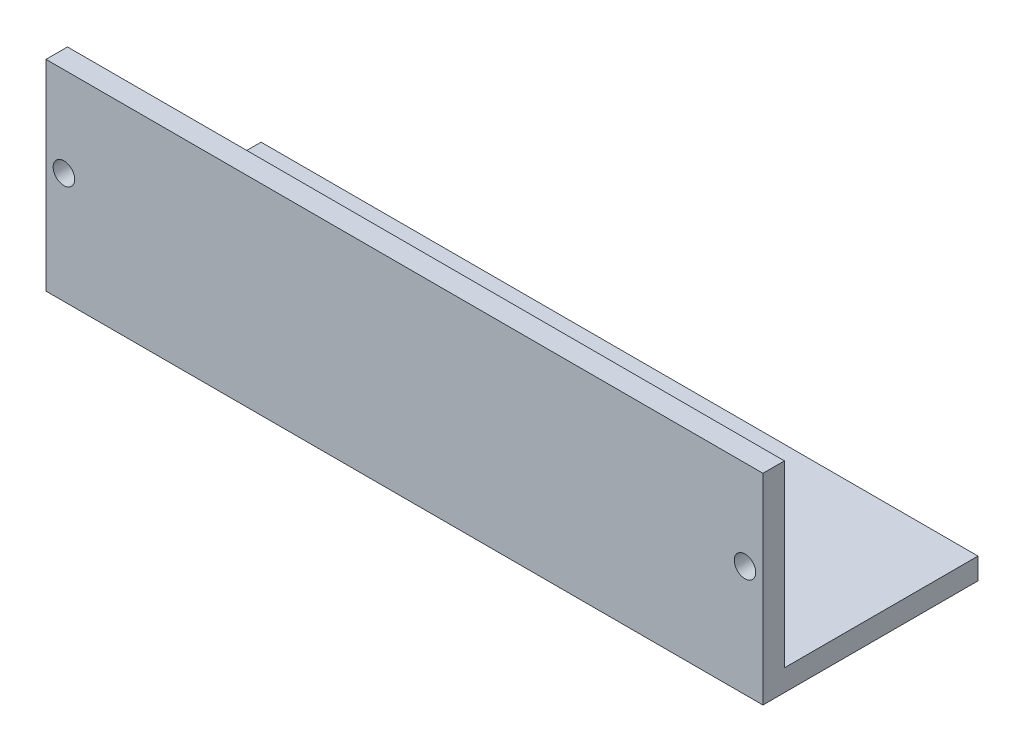
ISO-10303-21;
HEADER;
FILE_DESCRIPTION(('STEP AP214'),'2;1');
FILE_NAME('part.step','',(''),(''),'','','');
FILE_SCHEMA(('AUTOMOTIVE_DESIGN { 1 0 10303 214 1 1 1 1 }'));
ENDSEC;
DATA;
#1=APPLICATION_CONTEXT('core data for automotive mechanical design processes');
#2=APPLICATION_PROTOCOL_DEFINITION('international standard','automotive_design',2000,#1);
#3=PRODUCT_CONTEXT('',#1,'mechanical');
#4=PRODUCT('Part','Part','',(#3));
#5=PRODUCT_RELATED_PRODUCT_CATEGORY('part','',(#4));
#6=PRODUCT_DEFINITION_FORMATION('','',#4);
#7=PRODUCT_DEFINITION_CONTEXT('part definition',#1,'design');
#8=PRODUCT_DEFINITION('design','',#6,#7);
#9=PRODUCT_DEFINITION_SHAPE('','',#8);
#10=(LENGTH_UNIT() NAMED_UNIT(*) SI_UNIT(.MILLI.,.METRE.));
#11=(NAMED_UNIT(*) PLANE_ANGLE_UNIT() SI_UNIT($,.RADIAN.));
#12=(NAMED_UNIT(*) SI_UNIT($,.STERADIAN.) SOLID_ANGLE_UNIT());
#13=UNCERTAINTY_MEASURE_WITH_UNIT(LENGTH_MEASURE(1.E-05),#10,'distance_accuracy_value','');
#14=(GEOMETRIC_REPRESENTATION_CONTEXT(3) GLOBAL_UNCERTAINTY_ASSIGNED_CONTEXT((#13)) GLOBAL_UNIT_ASSIGNED_CONTEXT((#10,
#11,#12)) REPRESENTATION_CONTEXT('',''));
#15=CARTESIAN_POINT('',(0.,0.,0.));
#16=DIRECTION('',(0.,0.,1.));
#17=DIRECTION('',(1.,0.,0.));
#18=AXIS2_PLACEMENT_3D('',#15,#16,#17);
#19=CARTESIAN_POINT('',(0.,0.,0.));
#20=DIRECTION('',(0.,0.,1.));
#21=DIRECTION('',(1.,0.,0.));
#22=AXIS2_PLACEMENT_3D('',#19,#20,#21);
#23=PLANE('',#22);
#24=CARTESIAN_POINT('',(-47.5,0.,0.));
#25=DIRECTION('',(0.,0.,1.));
#26=DIRECTION('',(1.,0.,0.));
#27=AXIS2_PLACEMENT_3D('',#24,#25,#26);
#28=CIRCLE('',#27,1.5);
#29=CARTESIAN_POINT('',(-46.,0.,0.));
#30=VERTEX_POINT('',#29);
#31=EDGE_CURVE('E162',#30,#30,#28,.T.);
#32=ORIENTED_EDGE('',*,*,#31,.T.);
#33=EDGE_LOOP('',(#32));
#34=FACE_BOUND('',#33,.T.);
#35=DIRECTION('',(0.,1.,0.));
#36=VECTOR('',#35,1.);
#37=CARTESIAN_POINT('',(-20.,0.,0.));
#38=LINE('',#37,#36);
#39=CARTESIAN_POINT('',(-20.,-12.5,0.));
#40=VERTEX_POINT('',#39);
#41=CARTESIAN_POINT('',(-20.,12.5,0.));
#42=VERTEX_POINT('',#41);
#43=EDGE_CURVE('E117',#40,#42,#38,.T.);
#44=ORIENTED_EDGE('',*,*,#43,.F.);
#45=DIRECTION('',(1.,0.,0.));
#46=VECTOR('',#45,1.);
#47=CARTESIAN_POINT('',(-50.,-12.5,0.));
#48=LINE('',#47,#46);
#49=CARTESIAN_POINT('',(-50.,-12.5,0.));
#50=VERTEX_POINT('',#49);
#51=EDGE_CURVE('E106',#50,#40,#48,.T.);
#52=ORIENTED_EDGE('',*,*,#51,.F.);
#53=DIRECTION('',(0.,-1.,0.));
#54=VECTOR('',#53,1.);
#55=CARTESIAN_POINT('',(-50.,12.5,0.));
#56=LINE('',#55,#54);
#57=CARTESIAN_POINT('',(-50.,12.5,0.));
#58=VERTEX_POINT('',#57);
#59=EDGE_CURVE('E182',#58,#50,#56,.T.);
#60=ORIENTED_EDGE('',*,*,#59,.F.);
#61=DIRECTION('',(-1.,0.,0.));
#62=VECTOR('',#61,1.);
#63=CARTESIAN_POINT('',(-50.,12.5,0.));
#64=LINE('',#63,#62);
#65=EDGE_CURVE('E48',#42,#58,#64,.T.);
#66=ORIENTED_EDGE('',*,*,#65,.F.);
#67=EDGE_LOOP('',(#44,#52,#60,#66));
#68=FACE_BOUND('',#67,.T.);
#69=ADVANCED_FACE('F33',(#34,#68),#23,.F.);
#70=CARTESIAN_POINT('',(0.,0.,3.));
#71=DIRECTION('',(0.,0.,1.));
#72=DIRECTION('',(1.,0.,0.));
#73=AXIS2_PLACEMENT_3D('',#70,#71,#72);
#74=PLANE('',#73);
#75=DIRECTION('',(-1.,0.,0.));
#76=VECTOR('',#75,1.);
#77=CARTESIAN_POINT('',(-50.,12.5,3.));
#78=LINE('',#77,#76);
#79=CARTESIAN_POINT('',(50.,12.5,3.));
#80=VERTEX_POINT('',#79);
#81=CARTESIAN_POINT('',(-50.,12.5,3.));
#82=VERTEX_POINT('',#81);
#83=EDGE_CURVE('E173',#80,#82,#78,.T.);
#84=ORIENTED_EDGE('',*,*,#83,.T.);
#85=DIRECTION('',(0.,-1.,0.));
#86=VECTOR('',#85,1.);
#87=CARTESIAN_POINT('',(-50.,12.5,3.));
#88=LINE('',#87,#86);
#89=CARTESIAN_POINT('',(-50.,-15.5,3.));
#90=VERTEX_POINT('',#89);
#91=EDGE_CURVE('E175',#82,#90,#88,.T.);
#92=ORIENTED_EDGE('',*,*,#91,.T.);
#93=DIRECTION('',(-1.,0.,0.));
#94=VECTOR('',#93,1.);
#95=CARTESIAN_POINT('',(-50.,-15.5,3.));
#96=LINE('',#95,#94);
#97=CARTESIAN_POINT('',(50.,-15.5,3.));
#98=VERTEX_POINT('',#97);
#99=EDGE_CURVE('E145',#98,#90,#96,.T.);
#100=ORIENTED_EDGE('',*,*,#99,.F.);
#101=DIRECTION('',(0.,1.,0.));
#102=VECTOR('',#101,1.);
#103=CARTESIAN_POINT('',(50.,12.5,3.));
#104=LINE('',#103,#102);
#105=EDGE_CURVE('E113',#98,#80,#104,.T.);
#106=ORIENTED_EDGE('',*,*,#105,.T.);
#107=EDGE_LOOP('',(#84,#92,#100,#106));
#108=FACE_BOUND('',#107,.T.);
#109=CARTESIAN_POINT('',(47.5,0.,3.));
#110=DIRECTION('',(0.,0.,1.));
#111=DIRECTION('',(1.,0.,0.));
#112=AXIS2_PLACEMENT_3D('',#109,#110,#111);
#113=CIRCLE('',#112,1.5);
#114=CARTESIAN_POINT('',(49.,0.,3.));
#115=VERTEX_POINT('',#114);
#116=EDGE_CURVE('E159',#115,#115,#113,.T.);
#117=ORIENTED_EDGE('',*,*,#116,.F.);
#118=EDGE_LOOP('',(#117));
#119=FACE_BOUND('',#118,.T.);
#120=CARTESIAN_POINT('',(-47.5,0.,3.));
#121=DIRECTION('',(0.,0.,1.));
#122=DIRECTION('',(1.,0.,0.));
#123=AXIS2_PLACEMENT_3D('',#120,#121,#122);
#124=CIRCLE('',#123,1.5);
#125=CARTESIAN_POINT('',(-46.,0.,3.));
#126=VERTEX_POINT('',#125);
#127=EDGE_CURVE('E165',#126,#126,#124,.T.);
#128=ORIENTED_EDGE('',*,*,#127,.F.);
#129=EDGE_LOOP('',(#128));
#130=FACE_BOUND('',#129,.T.);
#131=ADVANCED_FACE('F214',(#108,#119,#130),#74,.T.);
#132=CARTESIAN_POINT('',(20.,-12.5,0.));
#133=VERTEX_POINT('',#132);
#134=CARTESIAN_POINT('',(50.,-12.5,0.));
#135=VERTEX_POINT('',#134);
#136=EDGE_CURVE('E114',#133,#135,#48,.T.);
#137=ORIENTED_EDGE('',*,*,#136,.F.);
#138=DIRECTION('',(0.,1.,0.));
#139=VECTOR('',#138,1.);
#140=CARTESIAN_POINT('',(20.,0.,0.));
#141=LINE('',#140,#139);
#142=CARTESIAN_POINT('',(20.,12.5,0.));
#143=VERTEX_POINT('',#142);
#144=EDGE_CURVE('E56',#133,#143,#141,.T.);
#145=ORIENTED_EDGE('',*,*,#144,.T.);
#146=CARTESIAN_POINT('',(50.,12.5,0.));
#147=VERTEX_POINT('',#146);
#148=EDGE_CURVE('E180',#147,#143,#64,.T.);
#149=ORIENTED_EDGE('',*,*,#148,.F.);
#150=DIRECTION('',(0.,1.,0.));
#151=VECTOR('',#150,1.);
#152=CARTESIAN_POINT('',(50.,12.5,0.));
#153=LINE('',#152,#151);
#154=EDGE_CURVE('E168',#135,#147,#153,.T.);
#155=ORIENTED_EDGE('',*,*,#154,.F.);
#156=EDGE_LOOP('',(#137,#145,#149,#155));
#157=FACE_BOUND('',#156,.T.);
#158=CARTESIAN_POINT('',(47.5,0.,0.));
#159=DIRECTION('',(0.,0.,1.));
#160=DIRECTION('',(1.,0.,0.));
#161=AXIS2_PLACEMENT_3D('',#158,#159,#160);
#162=CIRCLE('',#161,1.5);
#163=CARTESIAN_POINT('',(49.,0.,0.));
#164=VERTEX_POINT('',#163);
#165=EDGE_CURVE('E158',#164,#164,#162,.T.);
#166=ORIENTED_EDGE('',*,*,#165,.T.);
#167=EDGE_LOOP('',(#166));
#168=FACE_BOUND('',#167,.T.);
#169=ADVANCED_FACE('F201',(#157,#168),#23,.F.);
#170=CARTESIAN_POINT('',(50.,12.5,3.));
#171=DIRECTION('',(-1.,0.,0.));
#172=DIRECTION('',(0.,-1.,0.));
#173=AXIS2_PLACEMENT_3D('',#170,#171,#172);
#174=PLANE('',#173);
#175=ORIENTED_EDGE('',*,*,#154,.T.);
#176=DIRECTION('',(0.,0.,-1.));
#177=VECTOR('',#176,1.);
#178=CARTESIAN_POINT('',(50.,12.5,3.));
#179=LINE('',#178,#177);
#180=EDGE_CURVE('E11',#80,#147,#179,.T.);
#181=ORIENTED_EDGE('',*,*,#180,.F.);
#182=ORIENTED_EDGE('',*,*,#105,.F.);
#183=DIRECTION('',(0.,0.,1.));
#184=VECTOR('',#183,1.);
#185=CARTESIAN_POINT('',(50.,-15.5,3.));
#186=LINE('',#185,#184);
#187=CARTESIAN_POINT('',(50.,-15.5,-27.));
#188=VERTEX_POINT('',#187);
#189=EDGE_CURVE('E142',#188,#98,#186,.T.);
#190=ORIENTED_EDGE('',*,*,#189,.F.);
#191=DIRECTION('',(0.,1.,0.));
#192=VECTOR('',#191,1.);
#193=CARTESIAN_POINT('',(50.,-15.5,-27.));
#194=LINE('',#193,#192);
#195=CARTESIAN_POINT('',(50.,-12.5,-27.));
#196=VERTEX_POINT('',#195);
#197=EDGE_CURVE('E147',#188,#196,#194,.T.);
#198=ORIENTED_EDGE('',*,*,#197,.T.);
#199=DIRECTION('',(0.,0.,1.));
#200=VECTOR('',#199,1.);
#201=CARTESIAN_POINT('',(50.,-12.5,3.));
#202=LINE('',#201,#200);
#203=EDGE_CURVE('E140',#196,#135,#202,.T.);
#204=ORIENTED_EDGE('',*,*,#203,.T.);
#205=EDGE_LOOP('',(#175,#181,#182,#190,#198,#204));
#206=FACE_BOUND('',#205,.T.);
#207=ADVANCED_FACE('F35',(#206),#174,.F.);
#208=CARTESIAN_POINT('',(-50.,12.5,3.));
#209=DIRECTION('',(0.,-1.,0.));
#210=DIRECTION('',(0.,0.,-1.));
#211=AXIS2_PLACEMENT_3D('',#208,#209,#210);
#212=PLANE('',#211);
#213=ORIENTED_EDGE('',*,*,#148,.T.);
#214=DIRECTION('',(-1.,0.,0.));
#215=VECTOR('',#214,1.);
#216=CARTESIAN_POINT('',(-50.,12.5,0.));
#217=LINE('',#216,#215);
#218=EDGE_CURVE('E133',#42,#143,#217,.F.);
#219=ORIENTED_EDGE('',*,*,#218,.F.);
#220=ORIENTED_EDGE('',*,*,#65,.T.);
#221=DIRECTION('',(0.,0.,-1.));
#222=VECTOR('',#221,1.);
#223=CARTESIAN_POINT('',(-50.,12.5,3.));
#224=LINE('',#223,#222);
#225=EDGE_CURVE('E41',#82,#58,#224,.T.);
#226=ORIENTED_EDGE('',*,*,#225,.F.);
#227=ORIENTED_EDGE('',*,*,#83,.F.);
#228=ORIENTED_EDGE('',*,*,#180,.T.);
#229=EDGE_LOOP('',(#213,#219,#220,#226,#227,#228));
#230=FACE_BOUND('',#229,.T.);
#231=ADVANCED_FACE('F190',(#230),#212,.F.);
#232=CARTESIAN_POINT('',(-50.,12.5,3.));
#233=DIRECTION('',(1.,0.,0.));
#234=DIRECTION('',(0.,1.,0.));
#235=AXIS2_PLACEMENT_3D('',#232,#233,#234);
#236=PLANE('',#235);
#237=ORIENTED_EDGE('',*,*,#59,.T.);
#238=DIRECTION('',(0.,0.,-1.));
#239=VECTOR('',#238,1.);
#240=CARTESIAN_POINT('',(-50.,-12.5,3.));
#241=LINE('',#240,#239);
#242=CARTESIAN_POINT('',(-50.,-12.5,-27.));
#243=VERTEX_POINT('',#242);
#244=EDGE_CURVE('E112',#50,#243,#241,.T.);
#245=ORIENTED_EDGE('',*,*,#244,.T.);
#246=DIRECTION('',(0.,1.,0.));
#247=VECTOR('',#246,1.);
#248=CARTESIAN_POINT('',(-50.,-15.5,-27.));
#249=LINE('',#248,#247);
#250=CARTESIAN_POINT('',(-50.,-15.5,-27.));
#251=VERTEX_POINT('',#250);
#252=EDGE_CURVE('E155',#251,#243,#249,.T.);
#253=ORIENTED_EDGE('',*,*,#252,.F.);
#254=DIRECTION('',(0.,0.,-1.));
#255=VECTOR('',#254,1.);
#256=CARTESIAN_POINT('',(-50.,-15.5,3.));
#257=LINE('',#256,#255);
#258=EDGE_CURVE('E136',#90,#251,#257,.T.);
#259=ORIENTED_EDGE('',*,*,#258,.F.);
#260=ORIENTED_EDGE('',*,*,#91,.F.);
#261=ORIENTED_EDGE('',*,*,#225,.T.);
#262=EDGE_LOOP('',(#237,#245,#253,#259,#260,#261));
#263=FACE_BOUND('',#262,.T.);
#264=ADVANCED_FACE('F187',(#263),#236,.F.);
#265=CARTESIAN_POINT('',(-47.5,0.,3.));
#266=DIRECTION('',(0.,0.,-1.));
#267=DIRECTION('',(-1.,0.,0.));
#268=AXIS2_PLACEMENT_3D('',#265,#266,#267);
#269=CYLINDRICAL_SURFACE('',#268,1.5);
#270=ORIENTED_EDGE('',*,*,#127,.T.);
#271=EDGE_LOOP('',(#270));
#272=FACE_BOUND('',#271,.T.);
#273=ORIENTED_EDGE('',*,*,#31,.F.);
#274=EDGE_LOOP('',(#273));
#275=FACE_BOUND('',#274,.T.);
#276=ADVANCED_FACE('F222',(#272,#275),#269,.F.);
#277=CARTESIAN_POINT('',(47.5,0.,3.));
#278=DIRECTION('',(0.,0.,-1.));
#279=DIRECTION('',(-1.,0.,0.));
#280=AXIS2_PLACEMENT_3D('',#277,#278,#279);
#281=CYLINDRICAL_SURFACE('',#280,1.5);
#282=ORIENTED_EDGE('',*,*,#116,.T.);
#283=EDGE_LOOP('',(#282));
#284=FACE_BOUND('',#283,.T.);
#285=ORIENTED_EDGE('',*,*,#165,.F.);
#286=EDGE_LOOP('',(#285));
#287=FACE_BOUND('',#286,.T.);
#288=ADVANCED_FACE('F225',(#284,#287),#281,.F.);
#289=CARTESIAN_POINT('',(0.,-12.5,0.));
#290=DIRECTION('',(0.,-1.,0.));
#291=DIRECTION('',(0.,0.,-1.));
#292=AXIS2_PLACEMENT_3D('',#289,#290,#291);
#293=PLANE('',#292);
#294=DIRECTION('',(-1.,0.,0.));
#295=VECTOR('',#294,1.);
#296=CARTESIAN_POINT('',(0.,-12.5,-10.));
#297=LINE('',#296,#295);
#298=CARTESIAN_POINT('',(-20.,-12.5,-10.));
#299=VERTEX_POINT('',#298);
#300=CARTESIAN_POINT('',(20.,-12.5,-10.));
#301=VERTEX_POINT('',#300);
#302=EDGE_CURVE('E131',#299,#301,#297,.F.);
#303=ORIENTED_EDGE('',*,*,#302,.T.);
#304=DIRECTION('',(0.,0.,1.));
#305=VECTOR('',#304,1.);
#306=CARTESIAN_POINT('',(20.,-12.5,0.));
#307=LINE('',#306,#305);
#308=EDGE_CURVE('E126',#301,#133,#307,.T.);
#309=ORIENTED_EDGE('',*,*,#308,.T.);
#310=ORIENTED_EDGE('',*,*,#136,.T.);
#311=ORIENTED_EDGE('',*,*,#203,.F.);
#312=DIRECTION('',(1.,0.,0.));
#313=VECTOR('',#312,1.);
#314=CARTESIAN_POINT('',(-50.,-12.5,-27.));
#315=LINE('',#314,#313);
#316=EDGE_CURVE('E149',#243,#196,#315,.T.);
#317=ORIENTED_EDGE('',*,*,#316,.F.);
#318=ORIENTED_EDGE('',*,*,#244,.F.);
#319=ORIENTED_EDGE('',*,*,#51,.T.);
#320=DIRECTION('',(0.,0.,1.));
#321=VECTOR('',#320,1.);
#322=CARTESIAN_POINT('',(-20.,-12.5,0.));
#323=LINE('',#322,#321);
#324=EDGE_CURVE('E109',#299,#40,#323,.T.);
#325=ORIENTED_EDGE('',*,*,#324,.F.);
#326=EDGE_LOOP('',(#303,#309,#310,#311,#317,#318,#319,#325));
#327=FACE_BOUND('',#326,.T.);
#328=ADVANCED_FACE('F107',(#327),#293,.F.);
#329=CARTESIAN_POINT('',(-50.,-15.5,-27.));
#330=DIRECTION('',(0.,0.,1.));
#331=DIRECTION('',(1.,0.,0.));
#332=AXIS2_PLACEMENT_3D('',#329,#330,#331);
#333=PLANE('',#332);
#334=ORIENTED_EDGE('',*,*,#316,.T.);
#335=ORIENTED_EDGE('',*,*,#197,.F.);
#336=DIRECTION('',(1.,0.,0.));
#337=VECTOR('',#336,1.);
#338=CARTESIAN_POINT('',(-50.,-15.5,-27.));
#339=LINE('',#338,#337);
#340=EDGE_CURVE('E139',#251,#188,#339,.T.);
#341=ORIENTED_EDGE('',*,*,#340,.F.);
#342=ORIENTED_EDGE('',*,*,#252,.T.);
#343=EDGE_LOOP('',(#334,#335,#341,#342));
#344=FACE_BOUND('',#343,.T.);
#345=ADVANCED_FACE('F209',(#344),#333,.F.);
#346=CARTESIAN_POINT('',(0.,-15.5,0.));
#347=DIRECTION('',(0.,-1.,0.));
#348=DIRECTION('',(0.,0.,-1.));
#349=AXIS2_PLACEMENT_3D('',#346,#347,#348);
#350=PLANE('',#349);
#351=ORIENTED_EDGE('',*,*,#99,.T.);
#352=ORIENTED_EDGE('',*,*,#258,.T.);
#353=ORIENTED_EDGE('',*,*,#340,.T.);
#354=ORIENTED_EDGE('',*,*,#189,.T.);
#355=EDGE_LOOP('',(#351,#352,#353,#354));
#356=FACE_BOUND('',#355,.T.);
#357=ADVANCED_FACE('F211',(#356),#350,.T.);
#358=CARTESIAN_POINT('',(0.,12.5,0.));
#359=DIRECTION('',(0.,-0.371390676354104,0.928476690885259));
#360=DIRECTION('',(0.,-0.928476690885259,-0.371390676354104));
#361=AXIS2_PLACEMENT_3D('',#358,#359,#360);
#362=PLANE('',#361);
#363=DIRECTION('',(0.,-0.928476690885259,-0.371390676354104));
#364=VECTOR('',#363,1.);
#365=CARTESIAN_POINT('',(-20.,12.5,0.));
#366=LINE('',#365,#364);
#367=EDGE_CURVE('E124',#42,#299,#366,.T.);
#368=ORIENTED_EDGE('',*,*,#367,.F.);
#369=ORIENTED_EDGE('',*,*,#218,.T.);
#370=DIRECTION('',(0.,-0.928476690885259,-0.371390676354104));
#371=VECTOR('',#370,1.);
#372=CARTESIAN_POINT('',(20.,12.5,0.));
#373=LINE('',#372,#371);
#374=EDGE_CURVE('E121',#143,#301,#373,.T.);
#375=ORIENTED_EDGE('',*,*,#374,.T.);
#376=ORIENTED_EDGE('',*,*,#302,.F.);
#377=EDGE_LOOP('',(#368,#369,#375,#376));
#378=FACE_BOUND('',#377,.T.);
#379=ADVANCED_FACE('F194',(#378),#362,.F.);
#380=CARTESIAN_POINT('',(20.,-1.5,-12.));
#381=DIRECTION('',(1.,0.,0.));
#382=DIRECTION('',(0.,0.,-1.));
#383=AXIS2_PLACEMENT_3D('',#380,#381,#382);
#384=PLANE('',#383);
#385=ORIENTED_EDGE('',*,*,#308,.F.);
#386=ORIENTED_EDGE('',*,*,#374,.F.);
#387=ORIENTED_EDGE('',*,*,#144,.F.);
#388=EDGE_LOOP('',(#385,#386,#387));
#389=FACE_BOUND('',#388,.T.);
#390=ADVANCED_FACE('F197',(#389),#384,.T.);
#391=CARTESIAN_POINT('',(-20.,-1.5,-12.));
#392=DIRECTION('',(1.,0.,0.));
#393=DIRECTION('',(0.,0.,-1.));
#394=AXIS2_PLACEMENT_3D('',#391,#392,#393);
#395=PLANE('',#394);
#396=ORIENTED_EDGE('',*,*,#367,.T.);
#397=ORIENTED_EDGE('',*,*,#324,.T.);
#398=ORIENTED_EDGE('',*,*,#43,.T.);
#399=EDGE_LOOP('',(#396,#397,#398));
#400=FACE_BOUND('',#399,.T.);
#401=ADVANCED_FACE('F123',(#400),#395,.F.);
#402=CLOSED_SHELL('',(#69,#131,#169,#207,#231,#264,#276,#288,#328,#345,#357,#379,#390,#401));
#403=MANIFOLD_SOLID_BREP('B2',#402);
#404=ADVANCED_BREP_SHAPE_REPRESENTATION('',(#18,#403),#14);
#405=SHAPE_DEFINITION_REPRESENTATION(#9,#404);
ENDSEC;
END-ISO-10303-21;
